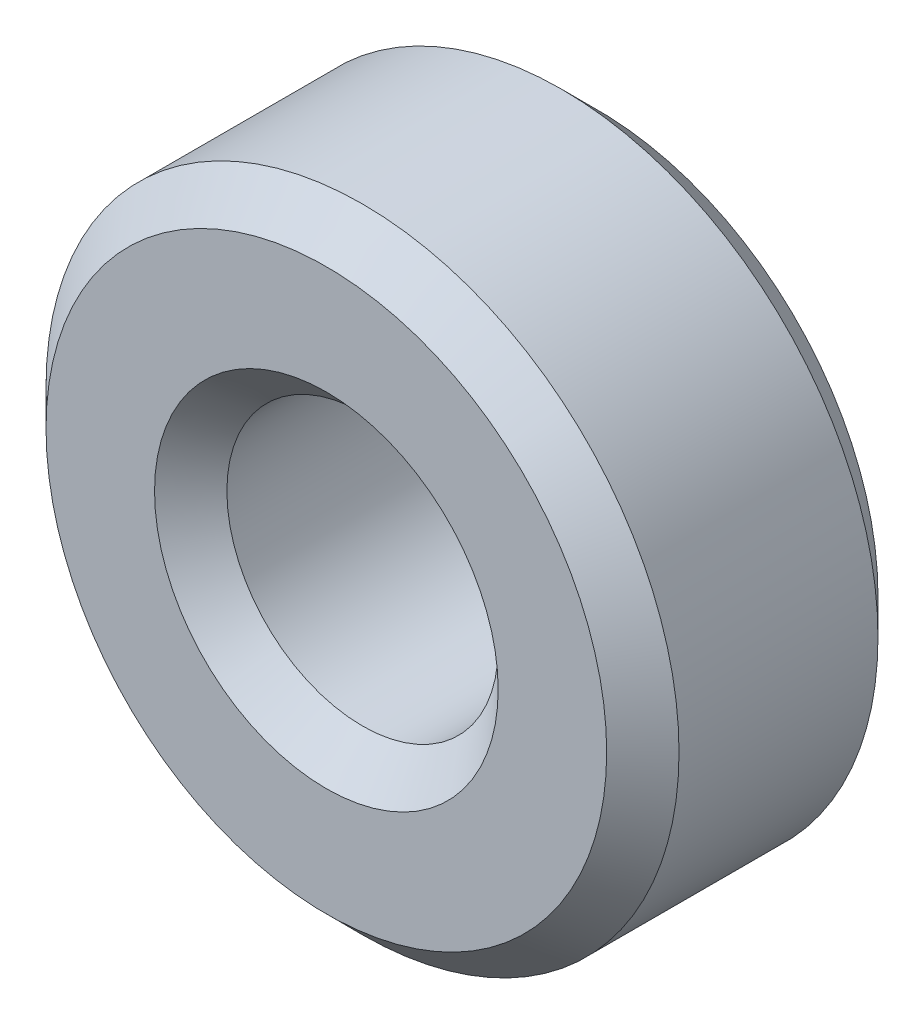
ISO-10303-21;
HEADER;
FILE_DESCRIPTION(('STEP AP214'),'2;1');
FILE_NAME('part.step','',(''),(''),'','','');
FILE_SCHEMA(('AUTOMOTIVE_DESIGN { 1 0 10303 214 1 1 1 1 }'));
ENDSEC;
DATA;
#1=APPLICATION_CONTEXT('core data for automotive mechanical design processes');
#2=APPLICATION_PROTOCOL_DEFINITION('international standard','automotive_design',2000,#1);
#3=PRODUCT_CONTEXT('',#1,'mechanical');
#4=PRODUCT('Part','Part','',(#3));
#5=PRODUCT_RELATED_PRODUCT_CATEGORY('part','',(#4));
#6=PRODUCT_DEFINITION_FORMATION('','',#4);
#7=PRODUCT_DEFINITION_CONTEXT('part definition',#1,'design');
#8=PRODUCT_DEFINITION('design','',#6,#7);
#9=PRODUCT_DEFINITION_SHAPE('','',#8);
#10=(LENGTH_UNIT() NAMED_UNIT(*) SI_UNIT(.MILLI.,.METRE.));
#11=(NAMED_UNIT(*) PLANE_ANGLE_UNIT() SI_UNIT($,.RADIAN.));
#12=(NAMED_UNIT(*) SI_UNIT($,.STERADIAN.) SOLID_ANGLE_UNIT());
#13=UNCERTAINTY_MEASURE_WITH_UNIT(LENGTH_MEASURE(1.E-05),#10,'distance_accuracy_value','');
#14=(GEOMETRIC_REPRESENTATION_CONTEXT(3) GLOBAL_UNCERTAINTY_ASSIGNED_CONTEXT((#13)) GLOBAL_UNIT_ASSIGNED_CONTEXT((#10,
#11,#12)) REPRESENTATION_CONTEXT('',''));
#15=CARTESIAN_POINT('',(0.,0.,0.));
#16=DIRECTION('',(0.,0.,1.));
#17=DIRECTION('',(1.,0.,0.));
#18=AXIS2_PLACEMENT_3D('',#15,#16,#17);
#19=CARTESIAN_POINT('',(0.,0.,3.));
#20=DIRECTION('',(0.,0.,1.));
#21=DIRECTION('',(1.,0.,0.));
#22=AXIS2_PLACEMENT_3D('',#19,#20,#21);
#23=PLANE('',#22);
#24=CARTESIAN_POINT('',(0.,0.,3.));
#25=DIRECTION('',(0.,0.,1.));
#26=DIRECTION('',(1.,0.,0.));
#27=AXIS2_PLACEMENT_3D('',#24,#25,#26);
#28=CIRCLE('',#27,1.9);
#29=CARTESIAN_POINT('',(1.9,0.,3.));
#30=VERTEX_POINT('',#29);
#31=EDGE_CURVE('E10',#30,#30,#28,.F.);
#32=ORIENTED_EDGE('',*,*,#31,.T.);
#33=EDGE_LOOP('',(#32));
#34=FACE_BOUND('',#33,.T.);
#35=CARTESIAN_POINT('',(0.,0.,3.));
#36=DIRECTION('',(0.,0.,1.));
#37=DIRECTION('',(1.,0.,0.));
#38=AXIS2_PLACEMENT_3D('',#35,#36,#37);
#39=CIRCLE('',#38,3.1);
#40=CARTESIAN_POINT('',(3.1,0.,3.));
#41=VERTEX_POINT('',#40);
#42=EDGE_CURVE('E43',#41,#41,#39,.T.);
#43=ORIENTED_EDGE('',*,*,#42,.T.);
#44=EDGE_LOOP('',(#43));
#45=FACE_BOUND('',#44,.T.);
#46=ADVANCED_FACE('F35',(#34,#45),#23,.T.);
#47=CARTESIAN_POINT('',(0.,0.,0.));
#48=DIRECTION('',(0.,0.,1.));
#49=DIRECTION('',(1.,0.,0.));
#50=AXIS2_PLACEMENT_3D('',#47,#48,#49);
#51=PLANE('',#50);
#52=CARTESIAN_POINT('',(0.,0.,0.));
#53=DIRECTION('',(0.,0.,1.));
#54=DIRECTION('',(1.,0.,0.));
#55=AXIS2_PLACEMENT_3D('',#52,#53,#54);
#56=CIRCLE('',#55,1.9);
#57=CARTESIAN_POINT('',(1.9,0.,0.));
#58=VERTEX_POINT('',#57);
#59=EDGE_CURVE('E62',#58,#58,#56,.T.);
#60=ORIENTED_EDGE('',*,*,#59,.T.);
#61=EDGE_LOOP('',(#60));
#62=FACE_BOUND('',#61,.T.);
#63=CARTESIAN_POINT('',(0.,0.,0.));
#64=DIRECTION('',(0.,0.,1.));
#65=DIRECTION('',(1.,0.,0.));
#66=AXIS2_PLACEMENT_3D('',#63,#64,#65);
#67=CIRCLE('',#66,3.1);
#68=CARTESIAN_POINT('',(3.1,0.,0.));
#69=VERTEX_POINT('',#68);
#70=EDGE_CURVE('E65',#69,#69,#67,.F.);
#71=ORIENTED_EDGE('',*,*,#70,.T.);
#72=EDGE_LOOP('',(#71));
#73=FACE_BOUND('',#72,.T.);
#74=ADVANCED_FACE('F69',(#62,#73),#51,.F.);
#75=CARTESIAN_POINT('',(0.,0.,3.));
#76=DIRECTION('',(0.,0.,-1.));
#77=DIRECTION('',(-1.,0.,0.));
#78=AXIS2_PLACEMENT_3D('',#75,#76,#77);
#79=CYLINDRICAL_SURFACE('',#78,3.5);
#80=CARTESIAN_POINT('',(0.,0.,0.400000000000002));
#81=DIRECTION('',(0.,0.,1.));
#82=DIRECTION('',(1.,0.,0.));
#83=AXIS2_PLACEMENT_3D('',#80,#81,#82);
#84=CIRCLE('',#83,3.5);
#85=CARTESIAN_POINT('',(3.5,0.,0.400000000000002));
#86=VERTEX_POINT('',#85);
#87=EDGE_CURVE('E47',#86,#86,#84,.T.);
#88=ORIENTED_EDGE('',*,*,#87,.T.);
#89=EDGE_LOOP('',(#88));
#90=FACE_BOUND('',#89,.T.);
#91=CARTESIAN_POINT('',(0.,0.,2.6));
#92=DIRECTION('',(0.,0.,1.));
#93=DIRECTION('',(1.,0.,0.));
#94=AXIS2_PLACEMENT_3D('',#91,#92,#93);
#95=CIRCLE('',#94,3.5);
#96=CARTESIAN_POINT('',(3.5,0.,2.6));
#97=VERTEX_POINT('',#96);
#98=EDGE_CURVE('E51',#97,#97,#95,.F.);
#99=ORIENTED_EDGE('',*,*,#98,.T.);
#100=EDGE_LOOP('',(#99));
#101=FACE_BOUND('',#100,.T.);
#102=ADVANCED_FACE('F79',(#90,#101),#79,.T.);
#103=CARTESIAN_POINT('',(0.,0.,3.));
#104=DIRECTION('',(0.,0.,-1.));
#105=DIRECTION('',(-1.,0.,0.));
#106=AXIS2_PLACEMENT_3D('',#103,#104,#105);
#107=CYLINDRICAL_SURFACE('',#106,1.5);
#108=CARTESIAN_POINT('',(0.,0.,0.400000000000001));
#109=DIRECTION('',(0.,0.,1.));
#110=DIRECTION('',(1.,0.,0.));
#111=AXIS2_PLACEMENT_3D('',#108,#109,#110);
#112=CIRCLE('',#111,1.5);
#113=CARTESIAN_POINT('',(1.5,0.,0.400000000000001));
#114=VERTEX_POINT('',#113);
#115=EDGE_CURVE('E56',#114,#114,#112,.F.);
#116=ORIENTED_EDGE('',*,*,#115,.T.);
#117=EDGE_LOOP('',(#116));
#118=FACE_BOUND('',#117,.T.);
#119=CARTESIAN_POINT('',(0.,0.,2.6));
#120=DIRECTION('',(0.,0.,1.));
#121=DIRECTION('',(1.,0.,0.));
#122=AXIS2_PLACEMENT_3D('',#119,#120,#121);
#123=CIRCLE('',#122,1.5);
#124=CARTESIAN_POINT('',(1.5,0.,2.6));
#125=VERTEX_POINT('',#124);
#126=EDGE_CURVE('E59',#125,#125,#123,.T.);
#127=ORIENTED_EDGE('',*,*,#126,.T.);
#128=EDGE_LOOP('',(#127));
#129=FACE_BOUND('',#128,.T.);
#130=ADVANCED_FACE('F82',(#118,#129),#107,.F.);
#131=CARTESIAN_POINT('',(0.,0.,0.));
#132=DIRECTION('',(0.,0.,-1.));
#133=DIRECTION('',(-1.,0.,0.));
#134=AXIS2_PLACEMENT_3D('',#131,#132,#133);
#135=CONICAL_SURFACE('',#134,1.9,0.785398163397445);
#136=ORIENTED_EDGE('',*,*,#115,.F.);
#137=EDGE_LOOP('',(#136));
#138=FACE_BOUND('',#137,.T.);
#139=ORIENTED_EDGE('',*,*,#59,.F.);
#140=EDGE_LOOP('',(#139));
#141=FACE_BOUND('',#140,.T.);
#142=ADVANCED_FACE('F75',(#138,#141),#135,.F.);
#143=CARTESIAN_POINT('',(0.,0.,0.400000000000002));
#144=DIRECTION('',(0.,0.,1.));
#145=DIRECTION('',(1.,0.,0.));
#146=AXIS2_PLACEMENT_3D('',#143,#144,#145);
#147=CONICAL_SURFACE('',#146,3.5,0.78539816339745);
#148=ORIENTED_EDGE('',*,*,#70,.F.);
#149=EDGE_LOOP('',(#148));
#150=FACE_BOUND('',#149,.T.);
#151=ORIENTED_EDGE('',*,*,#87,.F.);
#152=EDGE_LOOP('',(#151));
#153=FACE_BOUND('',#152,.T.);
#154=ADVANCED_FACE('F71',(#150,#153),#147,.T.);
#155=CARTESIAN_POINT('',(0.,0.,2.6));
#156=DIRECTION('',(0.,0.,1.));
#157=DIRECTION('',(1.,0.,0.));
#158=AXIS2_PLACEMENT_3D('',#155,#156,#157);
#159=CONICAL_SURFACE('',#158,1.5,0.785398163397451);
#160=ORIENTED_EDGE('',*,*,#31,.F.);
#161=EDGE_LOOP('',(#160));
#162=FACE_BOUND('',#161,.T.);
#163=ORIENTED_EDGE('',*,*,#126,.F.);
#164=EDGE_LOOP('',(#163));
#165=FACE_BOUND('',#164,.T.);
#166=ADVANCED_FACE('F74',(#162,#165),#159,.F.);
#167=CARTESIAN_POINT('',(0.,0.,3.));
#168=DIRECTION('',(0.,0.,-1.));
#169=DIRECTION('',(-1.,0.,0.));
#170=AXIS2_PLACEMENT_3D('',#167,#168,#169);
#171=CONICAL_SURFACE('',#170,3.1,0.785398163397446);
#172=ORIENTED_EDGE('',*,*,#98,.F.);
#173=EDGE_LOOP('',(#172));
#174=FACE_BOUND('',#173,.T.);
#175=ORIENTED_EDGE('',*,*,#42,.F.);
#176=EDGE_LOOP('',(#175));
#177=FACE_BOUND('',#176,.T.);
#178=ADVANCED_FACE('F38',(#174,#177),#171,.T.);
#179=CLOSED_SHELL('',(#46,#74,#102,#130,#142,#154,#166,#178));
#180=MANIFOLD_SOLID_BREP('B2',#179);
#181=ADVANCED_BREP_SHAPE_REPRESENTATION('',(#18,#180),#14);
#182=SHAPE_DEFINITION_REPRESENTATION(#9,#181);
ENDSEC;
END-ISO-10303-21;
